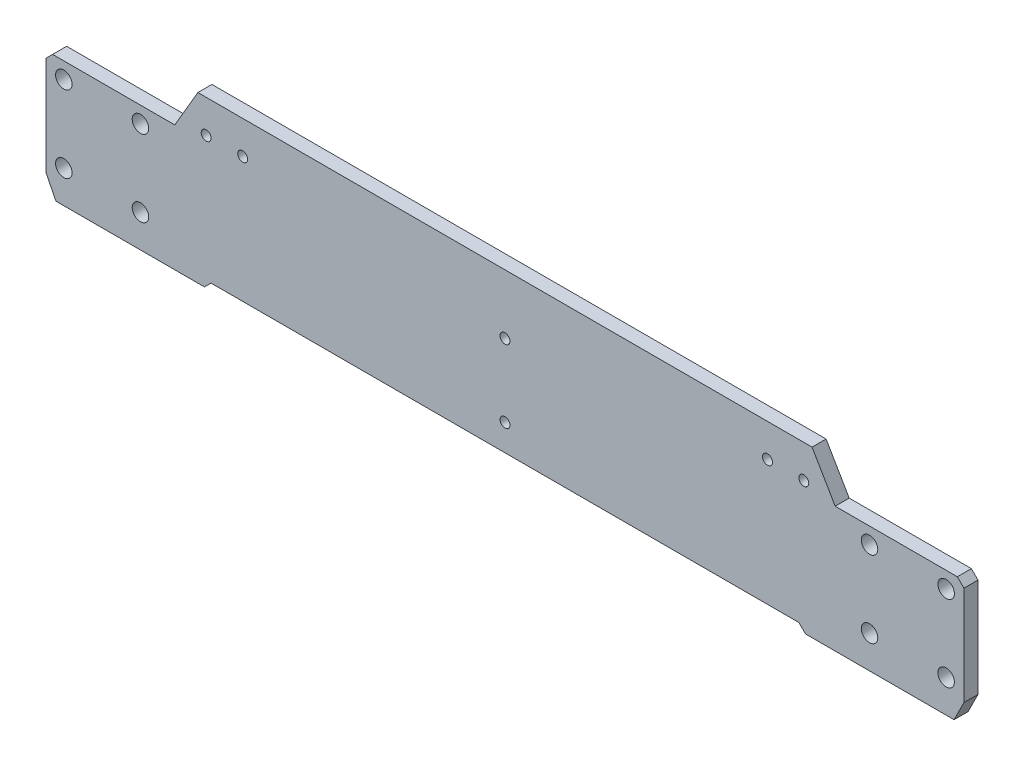
ISO-10303-21;
HEADER;
FILE_DESCRIPTION(('STEP AP214'),'2;1');
FILE_NAME('part.step','',(''),(''),'','','');
FILE_SCHEMA(('AUTOMOTIVE_DESIGN { 1 0 10303 214 1 1 1 1 }'));
ENDSEC;
DATA;
#1=APPLICATION_CONTEXT('core data for automotive mechanical design processes');
#2=APPLICATION_PROTOCOL_DEFINITION('international standard','automotive_design',2000,#1);
#3=PRODUCT_CONTEXT('',#1,'mechanical');
#4=PRODUCT('Part','Part','',(#3));
#5=PRODUCT_RELATED_PRODUCT_CATEGORY('part','',(#4));
#6=PRODUCT_DEFINITION_FORMATION('','',#4);
#7=PRODUCT_DEFINITION_CONTEXT('part definition',#1,'design');
#8=PRODUCT_DEFINITION('design','',#6,#7);
#9=PRODUCT_DEFINITION_SHAPE('','',#8);
#10=(LENGTH_UNIT() NAMED_UNIT(*) SI_UNIT(.MILLI.,.METRE.));
#11=(NAMED_UNIT(*) PLANE_ANGLE_UNIT() SI_UNIT($,.RADIAN.));
#12=(NAMED_UNIT(*) SI_UNIT($,.STERADIAN.) SOLID_ANGLE_UNIT());
#13=UNCERTAINTY_MEASURE_WITH_UNIT(LENGTH_MEASURE(1.E-05),#10,'distance_accuracy_value','');
#14=(GEOMETRIC_REPRESENTATION_CONTEXT(3) GLOBAL_UNCERTAINTY_ASSIGNED_CONTEXT((#13)) GLOBAL_UNIT_ASSIGNED_CONTEXT((#10,
#11,#12)) REPRESENTATION_CONTEXT('',''));
#15=CARTESIAN_POINT('',(0.,0.,0.));
#16=DIRECTION('',(0.,0.,1.));
#17=DIRECTION('',(1.,0.,0.));
#18=AXIS2_PLACEMENT_3D('',#15,#16,#17);
#19=CARTESIAN_POINT('',(0.,0.,4.25));
#20=DIRECTION('',(0.,0.,-1.));
#21=DIRECTION('',(-1.,0.,0.));
#22=AXIS2_PLACEMENT_3D('',#19,#20,#21);
#23=PLANE('',#22);
#24=DIRECTION('',(0.707106781186548,0.707106781186547,0.));
#25=VECTOR('',#24,1.);
#26=CARTESIAN_POINT('',(-91.,-3.,4.25));
#27=LINE('',#26,#25);
#28=CARTESIAN_POINT('',(-91.,-3.,4.25));
#29=VERTEX_POINT('',#28);
#30=CARTESIAN_POINT('',(-89.,-1.,4.25));
#31=VERTEX_POINT('',#30);
#32=EDGE_CURVE('E209',#29,#31,#27,.T.);
#33=ORIENTED_EDGE('',*,*,#32,.T.);
#34=DIRECTION('',(1.,0.,0.));
#35=VECTOR('',#34,1.);
#36=CARTESIAN_POINT('',(-89.,-1.,4.25));
#37=LINE('',#36,#35);
#38=CARTESIAN_POINT('',(89.,-1.,4.25));
#39=VERTEX_POINT('',#38);
#40=EDGE_CURVE('E117',#31,#39,#37,.T.);
#41=ORIENTED_EDGE('',*,*,#40,.T.);
#42=DIRECTION('',(0.707106781186548,-0.707106781186547,0.));
#43=VECTOR('',#42,1.);
#44=CARTESIAN_POINT('',(89.,-1.,4.25));
#45=LINE('',#44,#43);
#46=CARTESIAN_POINT('',(91.,-3.,4.25));
#47=VERTEX_POINT('',#46);
#48=EDGE_CURVE('E248',#39,#47,#45,.T.);
#49=ORIENTED_EDGE('',*,*,#48,.T.);
#50=DIRECTION('',(1.,0.,0.));
#51=VECTOR('',#50,1.);
#52=CARTESIAN_POINT('',(91.,-3.,4.25));
#53=LINE('',#52,#51);
#54=CARTESIAN_POINT('',(136.,-3.,4.25));
#55=VERTEX_POINT('',#54);
#56=EDGE_CURVE('E267',#47,#55,#53,.T.);
#57=ORIENTED_EDGE('',*,*,#56,.T.);
#58=DIRECTION('',(0.447213595499958,0.894427190999916,0.));
#59=VECTOR('',#58,1.);
#60=CARTESIAN_POINT('',(136.,-3.,4.25));
#61=LINE('',#60,#59);
#62=CARTESIAN_POINT('',(139.,3.,4.25));
#63=VERTEX_POINT('',#62);
#64=EDGE_CURVE('E264',#55,#63,#61,.T.);
#65=ORIENTED_EDGE('',*,*,#64,.T.);
#66=DIRECTION('',(0.,1.,0.));
#67=VECTOR('',#66,1.);
#68=CARTESIAN_POINT('',(139.,3.,4.25));
#69=LINE('',#68,#67);
#70=CARTESIAN_POINT('',(139.,33.,4.25));
#71=VERTEX_POINT('',#70);
#72=EDGE_CURVE('E266',#63,#71,#69,.T.);
#73=ORIENTED_EDGE('',*,*,#72,.T.);
#74=DIRECTION('',(-0.707106781186547,0.707106781186547,0.));
#75=VECTOR('',#74,1.);
#76=CARTESIAN_POINT('',(139.,33.,4.25));
#77=LINE('',#76,#75);
#78=CARTESIAN_POINT('',(137.,35.,4.25));
#79=VERTEX_POINT('',#78);
#80=EDGE_CURVE('E269',#71,#79,#77,.T.);
#81=ORIENTED_EDGE('',*,*,#80,.T.);
#82=DIRECTION('',(-1.,0.,0.));
#83=VECTOR('',#82,1.);
#84=CARTESIAN_POINT('',(137.,35.,4.25));
#85=LINE('',#84,#83);
#86=CARTESIAN_POINT('',(100.,35.,4.25));
#87=VERTEX_POINT('',#86);
#88=EDGE_CURVE('E275',#79,#87,#85,.T.);
#89=ORIENTED_EDGE('',*,*,#88,.T.);
#90=DIRECTION('',(-0.503871025524087,0.863778900898433,0.));
#91=VECTOR('',#90,1.);
#92=CARTESIAN_POINT('',(100.,35.,4.25));
#93=LINE('',#92,#91);
#94=CARTESIAN_POINT('',(93.,47.,4.25));
#95=VERTEX_POINT('',#94);
#96=EDGE_CURVE('E277',#87,#95,#93,.T.);
#97=ORIENTED_EDGE('',*,*,#96,.T.);
#98=DIRECTION('',(-1.,0.,0.));
#99=VECTOR('',#98,1.);
#100=CARTESIAN_POINT('',(93.,47.,4.25));
#101=LINE('',#100,#99);
#102=CARTESIAN_POINT('',(-93.,47.,4.25));
#103=VERTEX_POINT('',#102);
#104=EDGE_CURVE('E279',#95,#103,#101,.T.);
#105=ORIENTED_EDGE('',*,*,#104,.T.);
#106=DIRECTION('',(-0.503871025524087,-0.863778900898433,0.));
#107=VECTOR('',#106,1.);
#108=CARTESIAN_POINT('',(-93.,47.,4.25));
#109=LINE('',#108,#107);
#110=CARTESIAN_POINT('',(-100.,35.,4.25));
#111=VERTEX_POINT('',#110);
#112=EDGE_CURVE('E281',#103,#111,#109,.T.);
#113=ORIENTED_EDGE('',*,*,#112,.T.);
#114=DIRECTION('',(-1.,0.,0.));
#115=VECTOR('',#114,1.);
#116=CARTESIAN_POINT('',(-100.,35.,4.25));
#117=LINE('',#116,#115);
#118=CARTESIAN_POINT('',(-137.,35.,4.25));
#119=VERTEX_POINT('',#118);
#120=EDGE_CURVE('E283',#111,#119,#117,.T.);
#121=ORIENTED_EDGE('',*,*,#120,.T.);
#122=DIRECTION('',(-0.707106781186547,-0.707106781186547,0.));
#123=VECTOR('',#122,1.);
#124=CARTESIAN_POINT('',(-137.,35.,4.25));
#125=LINE('',#124,#123);
#126=CARTESIAN_POINT('',(-139.,33.,4.25));
#127=VERTEX_POINT('',#126);
#128=EDGE_CURVE('E160',#119,#127,#125,.T.);
#129=ORIENTED_EDGE('',*,*,#128,.T.);
#130=DIRECTION('',(0.,-1.,0.));
#131=VECTOR('',#130,1.);
#132=CARTESIAN_POINT('',(-139.,33.,4.25));
#133=LINE('',#132,#131);
#134=CARTESIAN_POINT('',(-139.,3.,4.25));
#135=VERTEX_POINT('',#134);
#136=EDGE_CURVE('E154',#127,#135,#133,.T.);
#137=ORIENTED_EDGE('',*,*,#136,.T.);
#138=DIRECTION('',(0.447213595499958,-0.894427190999916,0.));
#139=VECTOR('',#138,1.);
#140=CARTESIAN_POINT('',(-139.,3.,4.25));
#141=LINE('',#140,#139);
#142=CARTESIAN_POINT('',(-136.,-3.,4.25));
#143=VERTEX_POINT('',#142);
#144=EDGE_CURVE('E158',#135,#143,#141,.T.);
#145=ORIENTED_EDGE('',*,*,#144,.T.);
#146=DIRECTION('',(1.,0.,0.));
#147=VECTOR('',#146,1.);
#148=CARTESIAN_POINT('',(-136.,-3.,4.25));
#149=LINE('',#148,#147);
#150=EDGE_CURVE('E50',#143,#29,#149,.T.);
#151=ORIENTED_EDGE('',*,*,#150,.T.);
#152=EDGE_LOOP('',(#33,#41,#49,#57,#65,#73,#81,#89,#97,#105,#113,#121,#129,#137,#145,#151));
#153=FACE_BOUND('',#152,.T.);
#154=CARTESIAN_POINT('',(-133.600349176618,30.0998056751935,4.25));
#155=DIRECTION('',(0.,0.,1.));
#156=DIRECTION('',(1.,0.,0.));
#157=AXIS2_PLACEMENT_3D('',#154,#155,#156);
#158=CIRCLE('',#157,2.50002533855522);
#159=CARTESIAN_POINT('',(-131.100323838063,30.0998056751935,4.25));
#160=VERTEX_POINT('',#159);
#161=EDGE_CURVE('E182',#160,#160,#158,.T.);
#162=ORIENTED_EDGE('',*,*,#161,.F.);
#163=EDGE_LOOP('',(#162));
#164=FACE_BOUND('',#163,.T.);
#165=CARTESIAN_POINT('',(-110.397163400501,30.0865621547168,4.25));
#166=DIRECTION('',(0.,0.,1.));
#167=DIRECTION('',(1.,0.,0.));
#168=AXIS2_PLACEMENT_3D('',#165,#166,#167);
#169=CIRCLE('',#168,2.50003027489645);
#170=CARTESIAN_POINT('',(-107.897133125605,30.0865621547168,4.25));
#171=VERTEX_POINT('',#170);
#172=EDGE_CURVE('E447',#171,#171,#169,.T.);
#173=ORIENTED_EDGE('',*,*,#172,.F.);
#174=EDGE_LOOP('',(#173));
#175=FACE_BOUND('',#174,.T.);
#176=CARTESIAN_POINT('',(-133.597969419464,6.88582491159594,4.25));
#177=DIRECTION('',(0.,0.,1.));
#178=DIRECTION('',(1.,0.,0.));
#179=AXIS2_PLACEMENT_3D('',#176,#177,#178);
#180=CIRCLE('',#179,2.5005938502387);
#181=CARTESIAN_POINT('',(-131.097375569225,6.88582491159594,4.25));
#182=VERTEX_POINT('',#181);
#183=EDGE_CURVE('E441',#182,#182,#180,.T.);
#184=ORIENTED_EDGE('',*,*,#183,.F.);
#185=EDGE_LOOP('',(#184));
#186=FACE_BOUND('',#185,.T.);
#187=CARTESIAN_POINT('',(-110.4,6.899985,4.25));
#188=DIRECTION('',(0.,0.,1.));
#189=DIRECTION('',(1.,0.,0.));
#190=AXIS2_PLACEMENT_3D('',#187,#188,#189);
#191=CIRCLE('',#190,2.49996671038335);
#192=CARTESIAN_POINT('',(-107.900033289617,6.899985,4.25));
#193=VERTEX_POINT('',#192);
#194=EDGE_CURVE('E435',#193,#193,#191,.T.);
#195=ORIENTED_EDGE('',*,*,#194,.F.);
#196=EDGE_LOOP('',(#195));
#197=FACE_BOUND('',#196,.T.);
#198=CARTESIAN_POINT('',(-90.5,37.,4.25));
#199=DIRECTION('',(0.,0.,1.));
#200=DIRECTION('',(1.,0.,0.));
#201=AXIS2_PLACEMENT_3D('',#198,#199,#200);
#202=CIRCLE('',#201,1.50000660331879);
#203=CARTESIAN_POINT('',(-88.9999933966812,37.,4.25));
#204=VERTEX_POINT('',#203);
#205=EDGE_CURVE('E429',#204,#204,#202,.T.);
#206=ORIENTED_EDGE('',*,*,#205,.F.);
#207=EDGE_LOOP('',(#206));
#208=FACE_BOUND('',#207,.T.);
#209=CARTESIAN_POINT('',(-79.4350473912035,37.0054032383916,4.25));
#210=DIRECTION('',(0.,0.,1.));
#211=DIRECTION('',(1.,0.,0.));
#212=AXIS2_PLACEMENT_3D('',#209,#210,#211);
#213=CIRCLE('',#212,1.50001782666786);
#214=CARTESIAN_POINT('',(-77.9350295645357,37.0054032383916,4.25));
#215=VERTEX_POINT('',#214);
#216=EDGE_CURVE('E423',#215,#215,#213,.T.);
#217=ORIENTED_EDGE('',*,*,#216,.F.);
#218=EDGE_LOOP('',(#217));
#219=FACE_BOUND('',#218,.T.);
#220=CARTESIAN_POINT('',(1.62173108149942E-05,29.0000211501111,4.25));
#221=DIRECTION('',(0.,0.,1.));
#222=DIRECTION('',(1.,0.,0.));
#223=AXIS2_PLACEMENT_3D('',#220,#221,#222);
#224=CIRCLE('',#223,1.49999342487398);
#225=CARTESIAN_POINT('',(1.50000964218479,29.0000211501111,4.25));
#226=VERTEX_POINT('',#225);
#227=EDGE_CURVE('E417',#226,#226,#224,.T.);
#228=ORIENTED_EDGE('',*,*,#227,.F.);
#229=EDGE_LOOP('',(#228));
#230=FACE_BOUND('',#229,.T.);
#231=CARTESIAN_POINT('',(0.00751282601199458,6.99318405140734,4.25));
#232=DIRECTION('',(0.,0.,1.));
#233=DIRECTION('',(1.,0.,0.));
#234=AXIS2_PLACEMENT_3D('',#231,#232,#233);
#235=CIRCLE('',#234,1.50000156687934);
#236=CARTESIAN_POINT('',(1.50751439289133,6.99318405140734,4.25));
#237=VERTEX_POINT('',#236);
#238=EDGE_CURVE('E411',#237,#237,#235,.T.);
#239=ORIENTED_EDGE('',*,*,#238,.F.);
#240=EDGE_LOOP('',(#239));
#241=FACE_BOUND('',#240,.T.);
#242=CARTESIAN_POINT('',(79.5,37.,4.25));
#243=DIRECTION('',(0.,0.,1.));
#244=DIRECTION('',(1.,0.,0.));
#245=AXIS2_PLACEMENT_3D('',#242,#243,#244);
#246=CIRCLE('',#245,1.50000660331879);
#247=CARTESIAN_POINT('',(81.0000066033188,37.,4.25));
#248=VERTEX_POINT('',#247);
#249=EDGE_CURVE('E405',#248,#248,#246,.T.);
#250=ORIENTED_EDGE('',*,*,#249,.F.);
#251=EDGE_LOOP('',(#250));
#252=FACE_BOUND('',#251,.T.);
#253=CARTESIAN_POINT('',(90.5000059832746,37.0000112902454,4.25));
#254=DIRECTION('',(0.,0.,1.));
#255=DIRECTION('',(1.,0.,0.));
#256=AXIS2_PLACEMENT_3D('',#253,#254,#255);
#257=CIRCLE('',#256,1.49999401676786);
#258=CARTESIAN_POINT('',(92.0000000000425,37.0000112902454,4.25));
#259=VERTEX_POINT('',#258);
#260=EDGE_CURVE('E399',#259,#259,#257,.T.);
#261=ORIENTED_EDGE('',*,*,#260,.F.);
#262=EDGE_LOOP('',(#261));
#263=FACE_BOUND('',#262,.T.);
#264=CARTESIAN_POINT('',(110.399953709018,30.1000436867498,4.25));
#265=DIRECTION('',(0.,0.,1.));
#266=DIRECTION('',(1.,0.,0.));
#267=AXIS2_PLACEMENT_3D('',#264,#265,#266);
#268=CIRCLE('',#267,2.50004629136359);
#269=CARTESIAN_POINT('',(112.900000000382,30.1000436867498,4.25));
#270=VERTEX_POINT('',#269);
#271=EDGE_CURVE('E393',#270,#270,#268,.T.);
#272=ORIENTED_EDGE('',*,*,#271,.F.);
#273=EDGE_LOOP('',(#272));
#274=FACE_BOUND('',#273,.T.);
#275=CARTESIAN_POINT('',(133.599796532046,30.0999596192979,4.25));
#276=DIRECTION('',(0.,0.,1.));
#277=DIRECTION('',(1.,0.,0.));
#278=AXIS2_PLACEMENT_3D('',#275,#276,#277);
#279=CIRCLE('',#278,2.50020346828058);
#280=CARTESIAN_POINT('',(136.100000000326,30.0999596192979,4.25));
#281=VERTEX_POINT('',#280);
#282=EDGE_CURVE('E387',#281,#281,#279,.T.);
#283=ORIENTED_EDGE('',*,*,#282,.F.);
#284=EDGE_LOOP('',(#283));
#285=FACE_BOUND('',#284,.T.);
#286=CARTESIAN_POINT('',(110.399965537475,6.89991325703595,4.25));
#287=DIRECTION('',(0.,0.,1.));
#288=DIRECTION('',(1.,0.,0.));
#289=AXIS2_PLACEMENT_3D('',#286,#287,#288);
#290=CIRCLE('',#289,2.50003446370288);
#291=CARTESIAN_POINT('',(112.900000001178,6.89991325703595,4.25));
#292=VERTEX_POINT('',#291);
#293=EDGE_CURVE('E381',#292,#292,#290,.T.);
#294=ORIENTED_EDGE('',*,*,#293,.F.);
#295=EDGE_LOOP('',(#294));
#296=FACE_BOUND('',#295,.T.);
#297=CARTESIAN_POINT('',(133.599879489075,6.89978671149171,4.25));
#298=DIRECTION('',(0.,0.,1.));
#299=DIRECTION('',(1.,0.,0.));
#300=AXIS2_PLACEMENT_3D('',#297,#298,#299);
#301=CIRCLE('',#300,2.50015133773584);
#302=CARTESIAN_POINT('',(136.100030826811,6.89978671149171,4.25));
#303=VERTEX_POINT('',#302);
#304=EDGE_CURVE('E372',#303,#303,#301,.T.);
#305=ORIENTED_EDGE('',*,*,#304,.F.);
#306=EDGE_LOOP('',(#305));
#307=FACE_BOUND('',#306,.T.);
#308=ADVANCED_FACE('F33',(#153,#164,#175,#186,#197,#208,#219,#230,#241,#252,#263,#274,#285,#296,
#307),#23,.F.);
#309=CARTESIAN_POINT('',(0.,0.,0.));
#310=DIRECTION('',(0.,0.,-1.));
#311=DIRECTION('',(-1.,0.,0.));
#312=AXIS2_PLACEMENT_3D('',#309,#310,#311);
#313=PLANE('',#312);
#314=CARTESIAN_POINT('',(110.399965537475,6.89991325703595,0.));
#315=DIRECTION('',(0.,0.,1.));
#316=DIRECTION('',(1.,0.,0.));
#317=AXIS2_PLACEMENT_3D('',#314,#315,#316);
#318=CIRCLE('',#317,2.50003446370288);
#319=CARTESIAN_POINT('',(112.900000001178,6.89991325703595,0.));
#320=VERTEX_POINT('',#319);
#321=EDGE_CURVE('E378',#320,#320,#318,.T.);
#322=ORIENTED_EDGE('',*,*,#321,.T.);
#323=EDGE_LOOP('',(#322));
#324=FACE_BOUND('',#323,.T.);
#325=CARTESIAN_POINT('',(110.399953709018,30.1000436867498,0.));
#326=DIRECTION('',(0.,0.,1.));
#327=DIRECTION('',(1.,0.,0.));
#328=AXIS2_PLACEMENT_3D('',#325,#326,#327);
#329=CIRCLE('',#328,2.50004629136359);
#330=CARTESIAN_POINT('',(112.900000000382,30.1000436867498,0.));
#331=VERTEX_POINT('',#330);
#332=EDGE_CURVE('E390',#331,#331,#329,.T.);
#333=ORIENTED_EDGE('',*,*,#332,.T.);
#334=EDGE_LOOP('',(#333));
#335=FACE_BOUND('',#334,.T.);
#336=CARTESIAN_POINT('',(79.5,37.,0.));
#337=DIRECTION('',(0.,0.,1.));
#338=DIRECTION('',(1.,0.,0.));
#339=AXIS2_PLACEMENT_3D('',#336,#337,#338);
#340=CIRCLE('',#339,1.50000660331879);
#341=CARTESIAN_POINT('',(81.0000066033188,37.,0.));
#342=VERTEX_POINT('',#341);
#343=EDGE_CURVE('E402',#342,#342,#340,.T.);
#344=ORIENTED_EDGE('',*,*,#343,.T.);
#345=EDGE_LOOP('',(#344));
#346=FACE_BOUND('',#345,.T.);
#347=CARTESIAN_POINT('',(1.62173108149942E-05,29.0000211501111,0.));
#348=DIRECTION('',(0.,0.,1.));
#349=DIRECTION('',(1.,0.,0.));
#350=AXIS2_PLACEMENT_3D('',#347,#348,#349);
#351=CIRCLE('',#350,1.49999342487398);
#352=CARTESIAN_POINT('',(1.50000964218479,29.0000211501111,0.));
#353=VERTEX_POINT('',#352);
#354=EDGE_CURVE('E414',#353,#353,#351,.T.);
#355=ORIENTED_EDGE('',*,*,#354,.T.);
#356=EDGE_LOOP('',(#355));
#357=FACE_BOUND('',#356,.T.);
#358=CARTESIAN_POINT('',(-90.5,37.,0.));
#359=DIRECTION('',(0.,0.,1.));
#360=DIRECTION('',(1.,0.,0.));
#361=AXIS2_PLACEMENT_3D('',#358,#359,#360);
#362=CIRCLE('',#361,1.50000660331879);
#363=CARTESIAN_POINT('',(-88.9999933966812,37.,0.));
#364=VERTEX_POINT('',#363);
#365=EDGE_CURVE('E426',#364,#364,#362,.T.);
#366=ORIENTED_EDGE('',*,*,#365,.T.);
#367=EDGE_LOOP('',(#366));
#368=FACE_BOUND('',#367,.T.);
#369=CARTESIAN_POINT('',(-133.597969419464,6.88582491159594,0.));
#370=DIRECTION('',(0.,0.,1.));
#371=DIRECTION('',(1.,0.,0.));
#372=AXIS2_PLACEMENT_3D('',#369,#370,#371);
#373=CIRCLE('',#372,2.5005938502387);
#374=CARTESIAN_POINT('',(-131.097375569225,6.88582491159594,0.));
#375=VERTEX_POINT('',#374);
#376=EDGE_CURVE('E438',#375,#375,#373,.T.);
#377=ORIENTED_EDGE('',*,*,#376,.T.);
#378=EDGE_LOOP('',(#377));
#379=FACE_BOUND('',#378,.T.);
#380=CARTESIAN_POINT('',(-133.600349176618,30.0998056751935,0.));
#381=DIRECTION('',(0.,0.,1.));
#382=DIRECTION('',(1.,0.,0.));
#383=AXIS2_PLACEMENT_3D('',#380,#381,#382);
#384=CIRCLE('',#383,2.50002533855522);
#385=CARTESIAN_POINT('',(-131.100323838063,30.0998056751935,0.));
#386=VERTEX_POINT('',#385);
#387=EDGE_CURVE('E450',#386,#386,#384,.T.);
#388=ORIENTED_EDGE('',*,*,#387,.T.);
#389=EDGE_LOOP('',(#388));
#390=FACE_BOUND('',#389,.T.);
#391=DIRECTION('',(0.707106781186548,0.707106781186547,0.));
#392=VECTOR('',#391,1.);
#393=CARTESIAN_POINT('',(-91.,-3.,0.));
#394=LINE('',#393,#392);
#395=CARTESIAN_POINT('',(-91.,-3.,0.));
#396=VERTEX_POINT('',#395);
#397=CARTESIAN_POINT('',(-89.,-1.,0.));
#398=VERTEX_POINT('',#397);
#399=EDGE_CURVE('E178',#396,#398,#394,.T.);
#400=ORIENTED_EDGE('',*,*,#399,.F.);
#401=DIRECTION('',(1.,0.,0.));
#402=VECTOR('',#401,1.);
#403=CARTESIAN_POINT('',(-136.,-3.,0.));
#404=LINE('',#403,#402);
#405=CARTESIAN_POINT('',(-136.,-3.,0.));
#406=VERTEX_POINT('',#405);
#407=EDGE_CURVE('E109',#406,#396,#404,.T.);
#408=ORIENTED_EDGE('',*,*,#407,.F.);
#409=DIRECTION('',(0.447213595499958,-0.894427190999916,0.));
#410=VECTOR('',#409,1.);
#411=CARTESIAN_POINT('',(-139.,3.,0.));
#412=LINE('',#411,#410);
#413=CARTESIAN_POINT('',(-139.,3.,0.));
#414=VERTEX_POINT('',#413);
#415=EDGE_CURVE('E103',#414,#406,#412,.T.);
#416=ORIENTED_EDGE('',*,*,#415,.F.);
#417=DIRECTION('',(0.,-1.,0.));
#418=VECTOR('',#417,1.);
#419=CARTESIAN_POINT('',(-139.,33.,0.));
#420=LINE('',#419,#418);
#421=CARTESIAN_POINT('',(-139.,33.,0.));
#422=VERTEX_POINT('',#421);
#423=EDGE_CURVE('E168',#422,#414,#420,.T.);
#424=ORIENTED_EDGE('',*,*,#423,.F.);
#425=DIRECTION('',(-0.707106781186547,-0.707106781186547,0.));
#426=VECTOR('',#425,1.);
#427=CARTESIAN_POINT('',(-137.,35.,0.));
#428=LINE('',#427,#426);
#429=CARTESIAN_POINT('',(-137.,35.,0.));
#430=VERTEX_POINT('',#429);
#431=EDGE_CURVE('E204',#430,#422,#428,.T.);
#432=ORIENTED_EDGE('',*,*,#431,.F.);
#433=DIRECTION('',(-1.,0.,0.));
#434=VECTOR('',#433,1.);
#435=CARTESIAN_POINT('',(-100.,35.,0.));
#436=LINE('',#435,#434);
#437=CARTESIAN_POINT('',(-100.,35.,0.));
#438=VERTEX_POINT('',#437);
#439=EDGE_CURVE('E202',#438,#430,#436,.T.);
#440=ORIENTED_EDGE('',*,*,#439,.F.);
#441=DIRECTION('',(-0.503871025524087,-0.863778900898433,0.));
#442=VECTOR('',#441,1.);
#443=CARTESIAN_POINT('',(-93.,47.,0.));
#444=LINE('',#443,#442);
#445=CARTESIAN_POINT('',(-93.,47.,0.));
#446=VERTEX_POINT('',#445);
#447=EDGE_CURVE('E200',#446,#438,#444,.T.);
#448=ORIENTED_EDGE('',*,*,#447,.F.);
#449=DIRECTION('',(-1.,0.,0.));
#450=VECTOR('',#449,1.);
#451=CARTESIAN_POINT('',(93.,47.,0.));
#452=LINE('',#451,#450);
#453=CARTESIAN_POINT('',(93.,47.,0.));
#454=VERTEX_POINT('',#453);
#455=EDGE_CURVE('E198',#454,#446,#452,.T.);
#456=ORIENTED_EDGE('',*,*,#455,.F.);
#457=DIRECTION('',(-0.503871025524087,0.863778900898433,0.));
#458=VECTOR('',#457,1.);
#459=CARTESIAN_POINT('',(100.,35.,0.));
#460=LINE('',#459,#458);
#461=CARTESIAN_POINT('',(100.,35.,0.));
#462=VERTEX_POINT('',#461);
#463=EDGE_CURVE('E196',#462,#454,#460,.T.);
#464=ORIENTED_EDGE('',*,*,#463,.F.);
#465=DIRECTION('',(-1.,0.,0.));
#466=VECTOR('',#465,1.);
#467=CARTESIAN_POINT('',(137.,35.,0.));
#468=LINE('',#467,#466);
#469=CARTESIAN_POINT('',(137.,35.,0.));
#470=VERTEX_POINT('',#469);
#471=EDGE_CURVE('E194',#470,#462,#468,.T.);
#472=ORIENTED_EDGE('',*,*,#471,.F.);
#473=DIRECTION('',(-0.707106781186547,0.707106781186547,0.));
#474=VECTOR('',#473,1.);
#475=CARTESIAN_POINT('',(139.,33.,0.));
#476=LINE('',#475,#474);
#477=CARTESIAN_POINT('',(139.,33.,0.));
#478=VERTEX_POINT('',#477);
#479=EDGE_CURVE('E192',#478,#470,#476,.T.);
#480=ORIENTED_EDGE('',*,*,#479,.F.);
#481=DIRECTION('',(0.,1.,0.));
#482=VECTOR('',#481,1.);
#483=CARTESIAN_POINT('',(139.,3.,0.));
#484=LINE('',#483,#482);
#485=CARTESIAN_POINT('',(139.,3.,0.));
#486=VERTEX_POINT('',#485);
#487=EDGE_CURVE('E190',#486,#478,#484,.T.);
#488=ORIENTED_EDGE('',*,*,#487,.F.);
#489=DIRECTION('',(0.447213595499958,0.894427190999916,0.));
#490=VECTOR('',#489,1.);
#491=CARTESIAN_POINT('',(136.,-3.,0.));
#492=LINE('',#491,#490);
#493=CARTESIAN_POINT('',(136.,-3.,0.));
#494=VERTEX_POINT('',#493);
#495=EDGE_CURVE('E188',#494,#486,#492,.T.);
#496=ORIENTED_EDGE('',*,*,#495,.F.);
#497=DIRECTION('',(1.,0.,0.));
#498=VECTOR('',#497,1.);
#499=CARTESIAN_POINT('',(91.,-3.,0.));
#500=LINE('',#499,#498);
#501=CARTESIAN_POINT('',(91.,-3.,0.));
#502=VERTEX_POINT('',#501);
#503=EDGE_CURVE('E186',#502,#494,#500,.T.);
#504=ORIENTED_EDGE('',*,*,#503,.F.);
#505=DIRECTION('',(0.707106781186548,-0.707106781186547,0.));
#506=VECTOR('',#505,1.);
#507=CARTESIAN_POINT('',(89.,-1.,0.));
#508=LINE('',#507,#506);
#509=CARTESIAN_POINT('',(89.,-1.,0.));
#510=VERTEX_POINT('',#509);
#511=EDGE_CURVE('E184',#510,#502,#508,.T.);
#512=ORIENTED_EDGE('',*,*,#511,.F.);
#513=DIRECTION('',(1.,0.,0.));
#514=VECTOR('',#513,1.);
#515=CARTESIAN_POINT('',(-89.,-1.,0.));
#516=LINE('',#515,#514);
#517=EDGE_CURVE('E181',#398,#510,#516,.T.);
#518=ORIENTED_EDGE('',*,*,#517,.F.);
#519=EDGE_LOOP('',(#400,#408,#416,#424,#432,#440,#448,#456,#464,#472,#480,#488,#496,#504,#512,#518));
#520=FACE_BOUND('',#519,.T.);
#521=CARTESIAN_POINT('',(-110.397163400501,30.0865621547168,0.));
#522=DIRECTION('',(0.,0.,1.));
#523=DIRECTION('',(1.,0.,0.));
#524=AXIS2_PLACEMENT_3D('',#521,#522,#523);
#525=CIRCLE('',#524,2.50003027489645);
#526=CARTESIAN_POINT('',(-107.897133125605,30.0865621547168,0.));
#527=VERTEX_POINT('',#526);
#528=EDGE_CURVE('E444',#527,#527,#525,.T.);
#529=ORIENTED_EDGE('',*,*,#528,.T.);
#530=EDGE_LOOP('',(#529));
#531=FACE_BOUND('',#530,.T.);
#532=CARTESIAN_POINT('',(-110.4,6.899985,0.));
#533=DIRECTION('',(0.,0.,1.));
#534=DIRECTION('',(1.,0.,0.));
#535=AXIS2_PLACEMENT_3D('',#532,#533,#534);
#536=CIRCLE('',#535,2.49996671038335);
#537=CARTESIAN_POINT('',(-107.900033289617,6.899985,0.));
#538=VERTEX_POINT('',#537);
#539=EDGE_CURVE('E432',#538,#538,#536,.T.);
#540=ORIENTED_EDGE('',*,*,#539,.T.);
#541=EDGE_LOOP('',(#540));
#542=FACE_BOUND('',#541,.T.);
#543=CARTESIAN_POINT('',(-79.4350473912035,37.0054032383916,0.));
#544=DIRECTION('',(0.,0.,1.));
#545=DIRECTION('',(1.,0.,0.));
#546=AXIS2_PLACEMENT_3D('',#543,#544,#545);
#547=CIRCLE('',#546,1.50001782666786);
#548=CARTESIAN_POINT('',(-77.9350295645357,37.0054032383916,0.));
#549=VERTEX_POINT('',#548);
#550=EDGE_CURVE('E420',#549,#549,#547,.T.);
#551=ORIENTED_EDGE('',*,*,#550,.T.);
#552=EDGE_LOOP('',(#551));
#553=FACE_BOUND('',#552,.T.);
#554=CARTESIAN_POINT('',(0.00751282601199458,6.99318405140734,0.));
#555=DIRECTION('',(0.,0.,1.));
#556=DIRECTION('',(1.,0.,0.));
#557=AXIS2_PLACEMENT_3D('',#554,#555,#556);
#558=CIRCLE('',#557,1.50000156687934);
#559=CARTESIAN_POINT('',(1.50751439289133,6.99318405140734,0.));
#560=VERTEX_POINT('',#559);
#561=EDGE_CURVE('E408',#560,#560,#558,.T.);
#562=ORIENTED_EDGE('',*,*,#561,.T.);
#563=EDGE_LOOP('',(#562));
#564=FACE_BOUND('',#563,.T.);
#565=CARTESIAN_POINT('',(90.5000059832746,37.0000112902454,0.));
#566=DIRECTION('',(0.,0.,1.));
#567=DIRECTION('',(1.,0.,0.));
#568=AXIS2_PLACEMENT_3D('',#565,#566,#567);
#569=CIRCLE('',#568,1.49999401676786);
#570=CARTESIAN_POINT('',(92.0000000000425,37.0000112902454,0.));
#571=VERTEX_POINT('',#570);
#572=EDGE_CURVE('E396',#571,#571,#569,.T.);
#573=ORIENTED_EDGE('',*,*,#572,.T.);
#574=EDGE_LOOP('',(#573));
#575=FACE_BOUND('',#574,.T.);
#576=CARTESIAN_POINT('',(133.599796532046,30.0999596192979,0.));
#577=DIRECTION('',(0.,0.,1.));
#578=DIRECTION('',(1.,0.,0.));
#579=AXIS2_PLACEMENT_3D('',#576,#577,#578);
#580=CIRCLE('',#579,2.50020346828058);
#581=CARTESIAN_POINT('',(136.100000000326,30.0999596192979,0.));
#582=VERTEX_POINT('',#581);
#583=EDGE_CURVE('E384',#582,#582,#580,.T.);
#584=ORIENTED_EDGE('',*,*,#583,.T.);
#585=EDGE_LOOP('',(#584));
#586=FACE_BOUND('',#585,.T.);
#587=CARTESIAN_POINT('',(133.599879489075,6.89978671149171,0.));
#588=DIRECTION('',(0.,0.,1.));
#589=DIRECTION('',(1.,0.,0.));
#590=AXIS2_PLACEMENT_3D('',#587,#588,#589);
#591=CIRCLE('',#590,2.50015133773584);
#592=CARTESIAN_POINT('',(136.100030826811,6.89978671149171,0.));
#593=VERTEX_POINT('',#592);
#594=EDGE_CURVE('E375',#593,#593,#591,.T.);
#595=ORIENTED_EDGE('',*,*,#594,.T.);
#596=EDGE_LOOP('',(#595));
#597=FACE_BOUND('',#596,.T.);
#598=ADVANCED_FACE('F252',(#324,#335,#346,#357,#368,#379,#390,#520,#531,#542,#553,#564,#575,
#586,#597),#313,.T.);
#599=CARTESIAN_POINT('',(-91.,-3.,4.25));
#600=DIRECTION('',(-0.707106781186547,0.707106781186548,0.));
#601=DIRECTION('',(-0.707106781186548,-0.707106781186547,0.));
#602=AXIS2_PLACEMENT_3D('',#599,#600,#601);
#603=PLANE('',#602);
#604=ORIENTED_EDGE('',*,*,#399,.T.);
#605=DIRECTION('',(0.,0.,-1.));
#606=VECTOR('',#605,1.);
#607=CARTESIAN_POINT('',(-89.,-1.,4.25));
#608=LINE('',#607,#606);
#609=EDGE_CURVE('E11',#31,#398,#608,.T.);
#610=ORIENTED_EDGE('',*,*,#609,.F.);
#611=ORIENTED_EDGE('',*,*,#32,.F.);
#612=DIRECTION('',(0.,0.,-1.));
#613=VECTOR('',#612,1.);
#614=CARTESIAN_POINT('',(-91.,-3.,4.25));
#615=LINE('',#614,#613);
#616=EDGE_CURVE('E174',#29,#396,#615,.T.);
#617=ORIENTED_EDGE('',*,*,#616,.T.);
#618=EDGE_LOOP('',(#604,#610,#611,#617));
#619=FACE_BOUND('',#618,.T.);
#620=ADVANCED_FACE('F35',(#619),#603,.F.);
#621=CARTESIAN_POINT('',(-89.,-1.,4.25));
#622=DIRECTION('',(0.,1.,0.));
#623=DIRECTION('',(0.,0.,1.));
#624=AXIS2_PLACEMENT_3D('',#621,#622,#623);
#625=PLANE('',#624);
#626=ORIENTED_EDGE('',*,*,#517,.T.);
#627=DIRECTION('',(0.,0.,-1.));
#628=VECTOR('',#627,1.);
#629=CARTESIAN_POINT('',(89.,-1.,4.25));
#630=LINE('',#629,#628);
#631=EDGE_CURVE('E42',#39,#510,#630,.T.);
#632=ORIENTED_EDGE('',*,*,#631,.F.);
#633=ORIENTED_EDGE('',*,*,#40,.F.);
#634=ORIENTED_EDGE('',*,*,#609,.T.);
#635=EDGE_LOOP('',(#626,#632,#633,#634));
#636=FACE_BOUND('',#635,.T.);
#637=ADVANCED_FACE('F692',(#636),#625,.F.);
#638=CARTESIAN_POINT('',(89.,-1.,4.25));
#639=DIRECTION('',(0.707106781186547,0.707106781186548,0.));
#640=DIRECTION('',(-0.707106781186548,0.707106781186547,0.));
#641=AXIS2_PLACEMENT_3D('',#638,#639,#640);
#642=PLANE('',#641);
#643=ORIENTED_EDGE('',*,*,#511,.T.);
#644=DIRECTION('',(0.,0.,-1.));
#645=VECTOR('',#644,1.);
#646=CARTESIAN_POINT('',(91.,-3.,4.25));
#647=LINE('',#646,#645);
#648=EDGE_CURVE('E240',#47,#502,#647,.T.);
#649=ORIENTED_EDGE('',*,*,#648,.F.);
#650=ORIENTED_EDGE('',*,*,#48,.F.);
#651=ORIENTED_EDGE('',*,*,#631,.T.);
#652=EDGE_LOOP('',(#643,#649,#650,#651));
#653=FACE_BOUND('',#652,.T.);
#654=ADVANCED_FACE('F246',(#653),#642,.F.);
#655=CARTESIAN_POINT('',(91.,-3.,4.25));
#656=DIRECTION('',(0.,1.,0.));
#657=DIRECTION('',(0.,0.,1.));
#658=AXIS2_PLACEMENT_3D('',#655,#656,#657);
#659=PLANE('',#658);
#660=ORIENTED_EDGE('',*,*,#503,.T.);
#661=DIRECTION('',(0.,0.,-1.));
#662=VECTOR('',#661,1.);
#663=CARTESIAN_POINT('',(136.,-3.,4.25));
#664=LINE('',#663,#662);
#665=EDGE_CURVE('E237',#55,#494,#664,.T.);
#666=ORIENTED_EDGE('',*,*,#665,.F.);
#667=ORIENTED_EDGE('',*,*,#56,.F.);
#668=ORIENTED_EDGE('',*,*,#648,.T.);
#669=EDGE_LOOP('',(#660,#666,#667,#668));
#670=FACE_BOUND('',#669,.T.);
#671=ADVANCED_FACE('F258',(#670),#659,.F.);
#672=CARTESIAN_POINT('',(136.,-3.,4.25));
#673=DIRECTION('',(-0.894427190999916,0.447213595499958,0.));
#674=DIRECTION('',(-0.447213595499958,-0.894427190999916,0.));
#675=AXIS2_PLACEMENT_3D('',#672,#673,#674);
#676=PLANE('',#675);
#677=ORIENTED_EDGE('',*,*,#495,.T.);
#678=DIRECTION('',(0.,0.,-1.));
#679=VECTOR('',#678,1.);
#680=CARTESIAN_POINT('',(139.,3.,4.25));
#681=LINE('',#680,#679);
#682=EDGE_CURVE('E234',#63,#486,#681,.T.);
#683=ORIENTED_EDGE('',*,*,#682,.F.);
#684=ORIENTED_EDGE('',*,*,#64,.F.);
#685=ORIENTED_EDGE('',*,*,#665,.T.);
#686=EDGE_LOOP('',(#677,#683,#684,#685));
#687=FACE_BOUND('',#686,.T.);
#688=ADVANCED_FACE('F262',(#687),#676,.F.);
#689=CARTESIAN_POINT('',(139.,3.,4.25));
#690=DIRECTION('',(-1.,0.,0.));
#691=DIRECTION('',(0.,0.,1.));
#692=AXIS2_PLACEMENT_3D('',#689,#690,#691);
#693=PLANE('',#692);
#694=ORIENTED_EDGE('',*,*,#487,.T.);
#695=DIRECTION('',(0.,0.,-1.));
#696=VECTOR('',#695,1.);
#697=CARTESIAN_POINT('',(139.,33.,4.25));
#698=LINE('',#697,#696);
#699=EDGE_CURVE('E231',#71,#478,#698,.T.);
#700=ORIENTED_EDGE('',*,*,#699,.F.);
#701=ORIENTED_EDGE('',*,*,#72,.F.);
#702=ORIENTED_EDGE('',*,*,#682,.T.);
#703=EDGE_LOOP('',(#694,#700,#701,#702));
#704=FACE_BOUND('',#703,.T.);
#705=ADVANCED_FACE('F657',(#704),#693,.F.);
#706=CARTESIAN_POINT('',(139.,33.,4.25));
#707=DIRECTION('',(-0.707106781186548,-0.707106781186548,0.));
#708=DIRECTION('',(0.707106781186548,-0.707106781186548,0.));
#709=AXIS2_PLACEMENT_3D('',#706,#707,#708);
#710=PLANE('',#709);
#711=ORIENTED_EDGE('',*,*,#479,.T.);
#712=DIRECTION('',(0.,0.,-1.));
#713=VECTOR('',#712,1.);
#714=CARTESIAN_POINT('',(137.,35.,4.25));
#715=LINE('',#714,#713);
#716=EDGE_CURVE('E228',#79,#470,#715,.T.);
#717=ORIENTED_EDGE('',*,*,#716,.F.);
#718=ORIENTED_EDGE('',*,*,#80,.F.);
#719=ORIENTED_EDGE('',*,*,#699,.T.);
#720=EDGE_LOOP('',(#711,#717,#718,#719));
#721=FACE_BOUND('',#720,.T.);
#722=ADVANCED_FACE('F647',(#721),#710,.F.);
#723=CARTESIAN_POINT('',(137.,35.,4.25));
#724=DIRECTION('',(0.,-1.,0.));
#725=DIRECTION('',(0.,0.,-1.));
#726=AXIS2_PLACEMENT_3D('',#723,#724,#725);
#727=PLANE('',#726);
#728=ORIENTED_EDGE('',*,*,#471,.T.);
#729=DIRECTION('',(0.,0.,-1.));
#730=VECTOR('',#729,1.);
#731=CARTESIAN_POINT('',(100.,35.,4.25));
#732=LINE('',#731,#730);
#733=EDGE_CURVE('E225',#87,#462,#732,.T.);
#734=ORIENTED_EDGE('',*,*,#733,.F.);
#735=ORIENTED_EDGE('',*,*,#88,.F.);
#736=ORIENTED_EDGE('',*,*,#716,.T.);
#737=EDGE_LOOP('',(#728,#734,#735,#736));
#738=FACE_BOUND('',#737,.T.);
#739=ADVANCED_FACE('F637',(#738),#727,.F.);
#740=CARTESIAN_POINT('',(100.,35.,4.25));
#741=DIRECTION('',(-0.863778900898433,-0.503871025524087,0.));
#742=DIRECTION('',(0.503871025524087,-0.863778900898433,0.));
#743=AXIS2_PLACEMENT_3D('',#740,#741,#742);
#744=PLANE('',#743);
#745=ORIENTED_EDGE('',*,*,#463,.T.);
#746=DIRECTION('',(0.,0.,-1.));
#747=VECTOR('',#746,1.);
#748=CARTESIAN_POINT('',(93.,47.,4.25));
#749=LINE('',#748,#747);
#750=EDGE_CURVE('E222',#95,#454,#749,.T.);
#751=ORIENTED_EDGE('',*,*,#750,.F.);
#752=ORIENTED_EDGE('',*,*,#96,.F.);
#753=ORIENTED_EDGE('',*,*,#733,.T.);
#754=EDGE_LOOP('',(#745,#751,#752,#753));
#755=FACE_BOUND('',#754,.T.);
#756=ADVANCED_FACE('F627',(#755),#744,.F.);
#757=CARTESIAN_POINT('',(93.,47.,4.25));
#758=DIRECTION('',(0.,-1.,0.));
#759=DIRECTION('',(0.,0.,-1.));
#760=AXIS2_PLACEMENT_3D('',#757,#758,#759);
#761=PLANE('',#760);
#762=ORIENTED_EDGE('',*,*,#455,.T.);
#763=DIRECTION('',(0.,0.,-1.));
#764=VECTOR('',#763,1.);
#765=CARTESIAN_POINT('',(-93.,47.,4.25));
#766=LINE('',#765,#764);
#767=EDGE_CURVE('E219',#103,#446,#766,.T.);
#768=ORIENTED_EDGE('',*,*,#767,.F.);
#769=ORIENTED_EDGE('',*,*,#104,.F.);
#770=ORIENTED_EDGE('',*,*,#750,.T.);
#771=EDGE_LOOP('',(#762,#768,#769,#770));
#772=FACE_BOUND('',#771,.T.);
#773=ADVANCED_FACE('F617',(#772),#761,.F.);
#774=CARTESIAN_POINT('',(-93.,47.,4.25));
#775=DIRECTION('',(0.863778900898433,-0.503871025524087,0.));
#776=DIRECTION('',(0.503871025524087,0.863778900898433,0.));
#777=AXIS2_PLACEMENT_3D('',#774,#775,#776);
#778=PLANE('',#777);
#779=ORIENTED_EDGE('',*,*,#447,.T.);
#780=DIRECTION('',(0.,0.,-1.));
#781=VECTOR('',#780,1.);
#782=CARTESIAN_POINT('',(-100.,35.,4.25));
#783=LINE('',#782,#781);
#784=EDGE_CURVE('E216',#111,#438,#783,.T.);
#785=ORIENTED_EDGE('',*,*,#784,.F.);
#786=ORIENTED_EDGE('',*,*,#112,.F.);
#787=ORIENTED_EDGE('',*,*,#767,.T.);
#788=EDGE_LOOP('',(#779,#785,#786,#787));
#789=FACE_BOUND('',#788,.T.);
#790=ADVANCED_FACE('F608',(#789),#778,.F.);
#791=CARTESIAN_POINT('',(-100.,35.,4.25));
#792=DIRECTION('',(0.,-1.,0.));
#793=DIRECTION('',(0.,0.,-1.));
#794=AXIS2_PLACEMENT_3D('',#791,#792,#793);
#795=PLANE('',#794);
#796=ORIENTED_EDGE('',*,*,#439,.T.);
#797=DIRECTION('',(0.,0.,-1.));
#798=VECTOR('',#797,1.);
#799=CARTESIAN_POINT('',(-137.,35.,4.25));
#800=LINE('',#799,#798);
#801=EDGE_CURVE('E213',#119,#430,#800,.T.);
#802=ORIENTED_EDGE('',*,*,#801,.F.);
#803=ORIENTED_EDGE('',*,*,#120,.F.);
#804=ORIENTED_EDGE('',*,*,#784,.T.);
#805=EDGE_LOOP('',(#796,#802,#803,#804));
#806=FACE_BOUND('',#805,.T.);
#807=ADVANCED_FACE('F289',(#806),#795,.F.);
#808=CARTESIAN_POINT('',(-137.,35.,4.25));
#809=DIRECTION('',(0.707106781186548,-0.707106781186548,0.));
#810=DIRECTION('',(0.707106781186548,0.707106781186548,0.));
#811=AXIS2_PLACEMENT_3D('',#808,#809,#810);
#812=PLANE('',#811);
#813=ORIENTED_EDGE('',*,*,#431,.T.);
#814=DIRECTION('',(0.,0.,-1.));
#815=VECTOR('',#814,1.);
#816=CARTESIAN_POINT('',(-139.,33.,4.25));
#817=LINE('',#816,#815);
#818=EDGE_CURVE('E169',#127,#422,#817,.T.);
#819=ORIENTED_EDGE('',*,*,#818,.F.);
#820=ORIENTED_EDGE('',*,*,#128,.F.);
#821=ORIENTED_EDGE('',*,*,#801,.T.);
#822=EDGE_LOOP('',(#813,#819,#820,#821));
#823=FACE_BOUND('',#822,.T.);
#824=ADVANCED_FACE('F293',(#823),#812,.F.);
#825=CARTESIAN_POINT('',(-139.,33.,4.25));
#826=DIRECTION('',(1.,0.,0.));
#827=DIRECTION('',(0.,0.,-1.));
#828=AXIS2_PLACEMENT_3D('',#825,#826,#827);
#829=PLANE('',#828);
#830=ORIENTED_EDGE('',*,*,#423,.T.);
#831=DIRECTION('',(0.,0.,-1.));
#832=VECTOR('',#831,1.);
#833=CARTESIAN_POINT('',(-139.,3.,4.25));
#834=LINE('',#833,#832);
#835=EDGE_CURVE('E165',#135,#414,#834,.T.);
#836=ORIENTED_EDGE('',*,*,#835,.F.);
#837=ORIENTED_EDGE('',*,*,#136,.F.);
#838=ORIENTED_EDGE('',*,*,#818,.T.);
#839=EDGE_LOOP('',(#830,#836,#837,#838));
#840=FACE_BOUND('',#839,.T.);
#841=ADVANCED_FACE('F166',(#840),#829,.F.);
#842=CARTESIAN_POINT('',(-139.,3.,4.25));
#843=DIRECTION('',(0.894427190999916,0.447213595499958,0.));
#844=DIRECTION('',(-0.447213595499958,0.894427190999916,0.));
#845=AXIS2_PLACEMENT_3D('',#842,#843,#844);
#846=PLANE('',#845);
#847=ORIENTED_EDGE('',*,*,#415,.T.);
#848=DIRECTION('',(0.,0.,-1.));
#849=VECTOR('',#848,1.);
#850=CARTESIAN_POINT('',(-136.,-3.,4.25));
#851=LINE('',#850,#849);
#852=EDGE_CURVE('E170',#143,#406,#851,.T.);
#853=ORIENTED_EDGE('',*,*,#852,.F.);
#854=ORIENTED_EDGE('',*,*,#144,.F.);
#855=ORIENTED_EDGE('',*,*,#835,.T.);
#856=EDGE_LOOP('',(#847,#853,#854,#855));
#857=FACE_BOUND('',#856,.T.);
#858=ADVANCED_FACE('F172',(#857),#846,.F.);
#859=CARTESIAN_POINT('',(-136.,-3.,4.25));
#860=DIRECTION('',(0.,1.,0.));
#861=DIRECTION('',(0.,0.,1.));
#862=AXIS2_PLACEMENT_3D('',#859,#860,#861);
#863=PLANE('',#862);
#864=ORIENTED_EDGE('',*,*,#407,.T.);
#865=ORIENTED_EDGE('',*,*,#616,.F.);
#866=ORIENTED_EDGE('',*,*,#150,.F.);
#867=ORIENTED_EDGE('',*,*,#852,.T.);
#868=EDGE_LOOP('',(#864,#865,#866,#867));
#869=FACE_BOUND('',#868,.T.);
#870=ADVANCED_FACE('F297',(#869),#863,.F.);
#871=CARTESIAN_POINT('',(-133.600349176618,30.0998056751935,4.25));
#872=DIRECTION('',(0.,0.,-1.));
#873=DIRECTION('',(-1.,0.,0.));
#874=AXIS2_PLACEMENT_3D('',#871,#872,#873);
#875=CYLINDRICAL_SURFACE('',#874,2.50002533855522);
#876=ORIENTED_EDGE('',*,*,#161,.T.);
#877=EDGE_LOOP('',(#876));
#878=FACE_BOUND('',#877,.T.);
#879=ORIENTED_EDGE('',*,*,#387,.F.);
#880=EDGE_LOOP('',(#879));
#881=FACE_BOUND('',#880,.T.);
#882=ADVANCED_FACE('F299',(#878,#881),#875,.F.);
#883=CARTESIAN_POINT('',(-110.397163400501,30.0865621547168,4.25));
#884=DIRECTION('',(0.,0.,-1.));
#885=DIRECTION('',(-1.,0.,0.));
#886=AXIS2_PLACEMENT_3D('',#883,#884,#885);
#887=CYLINDRICAL_SURFACE('',#886,2.50003027489645);
#888=ORIENTED_EDGE('',*,*,#172,.T.);
#889=EDGE_LOOP('',(#888));
#890=FACE_BOUND('',#889,.T.);
#891=ORIENTED_EDGE('',*,*,#528,.F.);
#892=EDGE_LOOP('',(#891));
#893=FACE_BOUND('',#892,.T.);
#894=ADVANCED_FACE('F305',(#890,#893),#887,.F.);
#895=CARTESIAN_POINT('',(-133.597969419464,6.88582491159594,4.25));
#896=DIRECTION('',(0.,0.,-1.));
#897=DIRECTION('',(-1.,0.,0.));
#898=AXIS2_PLACEMENT_3D('',#895,#896,#897);
#899=CYLINDRICAL_SURFACE('',#898,2.5005938502387);
#900=ORIENTED_EDGE('',*,*,#183,.T.);
#901=EDGE_LOOP('',(#900));
#902=FACE_BOUND('',#901,.T.);
#903=ORIENTED_EDGE('',*,*,#376,.F.);
#904=EDGE_LOOP('',(#903));
#905=FACE_BOUND('',#904,.T.);
#906=ADVANCED_FACE('F319',(#902,#905),#899,.F.);
#907=CARTESIAN_POINT('',(-110.4,6.899985,4.25));
#908=DIRECTION('',(0.,0.,-1.));
#909=DIRECTION('',(-1.,0.,0.));
#910=AXIS2_PLACEMENT_3D('',#907,#908,#909);
#911=CYLINDRICAL_SURFACE('',#910,2.49996671038335);
#912=ORIENTED_EDGE('',*,*,#194,.T.);
#913=EDGE_LOOP('',(#912));
#914=FACE_BOUND('',#913,.T.);
#915=ORIENTED_EDGE('',*,*,#539,.F.);
#916=EDGE_LOOP('',(#915));
#917=FACE_BOUND('',#916,.T.);
#918=ADVANCED_FACE('F323',(#914,#917),#911,.F.);
#919=CARTESIAN_POINT('',(-90.5,37.,4.25));
#920=DIRECTION('',(0.,0.,-1.));
#921=DIRECTION('',(-1.,0.,0.));
#922=AXIS2_PLACEMENT_3D('',#919,#920,#921);
#923=CYLINDRICAL_SURFACE('',#922,1.50000660331879);
#924=ORIENTED_EDGE('',*,*,#205,.T.);
#925=EDGE_LOOP('',(#924));
#926=FACE_BOUND('',#925,.T.);
#927=ORIENTED_EDGE('',*,*,#365,.F.);
#928=EDGE_LOOP('',(#927));
#929=FACE_BOUND('',#928,.T.);
#930=ADVANCED_FACE('F327',(#926,#929),#923,.F.);
#931=CARTESIAN_POINT('',(-79.4350473912035,37.0054032383916,4.25));
#932=DIRECTION('',(0.,0.,-1.));
#933=DIRECTION('',(-1.,0.,0.));
#934=AXIS2_PLACEMENT_3D('',#931,#932,#933);
#935=CYLINDRICAL_SURFACE('',#934,1.50001782666786);
#936=ORIENTED_EDGE('',*,*,#216,.T.);
#937=EDGE_LOOP('',(#936));
#938=FACE_BOUND('',#937,.T.);
#939=ORIENTED_EDGE('',*,*,#550,.F.);
#940=EDGE_LOOP('',(#939));
#941=FACE_BOUND('',#940,.T.);
#942=ADVANCED_FACE('F331',(#938,#941),#935,.F.);
#943=CARTESIAN_POINT('',(1.62173108149942E-05,29.0000211501111,4.25));
#944=DIRECTION('',(0.,0.,-1.));
#945=DIRECTION('',(-1.,0.,0.));
#946=AXIS2_PLACEMENT_3D('',#943,#944,#945);
#947=CYLINDRICAL_SURFACE('',#946,1.49999342487398);
#948=ORIENTED_EDGE('',*,*,#227,.T.);
#949=EDGE_LOOP('',(#948));
#950=FACE_BOUND('',#949,.T.);
#951=ORIENTED_EDGE('',*,*,#354,.F.);
#952=EDGE_LOOP('',(#951));
#953=FACE_BOUND('',#952,.T.);
#954=ADVANCED_FACE('F335',(#950,#953),#947,.F.);
#955=CARTESIAN_POINT('',(0.00751282601199458,6.99318405140734,4.25));
#956=DIRECTION('',(0.,0.,-1.));
#957=DIRECTION('',(-1.,0.,0.));
#958=AXIS2_PLACEMENT_3D('',#955,#956,#957);
#959=CYLINDRICAL_SURFACE('',#958,1.50000156687934);
#960=ORIENTED_EDGE('',*,*,#238,.T.);
#961=EDGE_LOOP('',(#960));
#962=FACE_BOUND('',#961,.T.);
#963=ORIENTED_EDGE('',*,*,#561,.F.);
#964=EDGE_LOOP('',(#963));
#965=FACE_BOUND('',#964,.T.);
#966=ADVANCED_FACE('F339',(#962,#965),#959,.F.);
#967=CARTESIAN_POINT('',(79.5,37.,4.25));
#968=DIRECTION('',(0.,0.,-1.));
#969=DIRECTION('',(-1.,0.,0.));
#970=AXIS2_PLACEMENT_3D('',#967,#968,#969);
#971=CYLINDRICAL_SURFACE('',#970,1.50000660331879);
#972=ORIENTED_EDGE('',*,*,#249,.T.);
#973=EDGE_LOOP('',(#972));
#974=FACE_BOUND('',#973,.T.);
#975=ORIENTED_EDGE('',*,*,#343,.F.);
#976=EDGE_LOOP('',(#975));
#977=FACE_BOUND('',#976,.T.);
#978=ADVANCED_FACE('F343',(#974,#977),#971,.F.);
#979=CARTESIAN_POINT('',(90.5000059832746,37.0000112902454,4.25));
#980=DIRECTION('',(0.,0.,-1.));
#981=DIRECTION('',(-1.,0.,0.));
#982=AXIS2_PLACEMENT_3D('',#979,#980,#981);
#983=CYLINDRICAL_SURFACE('',#982,1.49999401676786);
#984=ORIENTED_EDGE('',*,*,#260,.T.);
#985=EDGE_LOOP('',(#984));
#986=FACE_BOUND('',#985,.T.);
#987=ORIENTED_EDGE('',*,*,#572,.F.);
#988=EDGE_LOOP('',(#987));
#989=FACE_BOUND('',#988,.T.);
#990=ADVANCED_FACE('F347',(#986,#989),#983,.F.);
#991=CARTESIAN_POINT('',(110.399953709018,30.1000436867498,4.25));
#992=DIRECTION('',(0.,0.,-1.));
#993=DIRECTION('',(-1.,0.,0.));
#994=AXIS2_PLACEMENT_3D('',#991,#992,#993);
#995=CYLINDRICAL_SURFACE('',#994,2.50004629136359);
#996=ORIENTED_EDGE('',*,*,#271,.T.);
#997=EDGE_LOOP('',(#996));
#998=FACE_BOUND('',#997,.T.);
#999=ORIENTED_EDGE('',*,*,#332,.F.);
#1000=EDGE_LOOP('',(#999));
#1001=FACE_BOUND('',#1000,.T.);
#1002=ADVANCED_FACE('F351',(#998,#1001),#995,.F.);
#1003=CARTESIAN_POINT('',(133.599796532046,30.0999596192979,4.25));
#1004=DIRECTION('',(0.,0.,-1.));
#1005=DIRECTION('',(-1.,0.,0.));
#1006=AXIS2_PLACEMENT_3D('',#1003,#1004,#1005);
#1007=CYLINDRICAL_SURFACE('',#1006,2.50020346828058);
#1008=ORIENTED_EDGE('',*,*,#282,.T.);
#1009=EDGE_LOOP('',(#1008));
#1010=FACE_BOUND('',#1009,.T.);
#1011=ORIENTED_EDGE('',*,*,#583,.F.);
#1012=EDGE_LOOP('',(#1011));
#1013=FACE_BOUND('',#1012,.T.);
#1014=ADVANCED_FACE('F355',(#1010,#1013),#1007,.F.);
#1015=CARTESIAN_POINT('',(110.399965537475,6.89991325703595,4.25));
#1016=DIRECTION('',(0.,0.,-1.));
#1017=DIRECTION('',(-1.,0.,0.));
#1018=AXIS2_PLACEMENT_3D('',#1015,#1016,#1017);
#1019=CYLINDRICAL_SURFACE('',#1018,2.50003446370288);
#1020=ORIENTED_EDGE('',*,*,#293,.T.);
#1021=EDGE_LOOP('',(#1020));
#1022=FACE_BOUND('',#1021,.T.);
#1023=ORIENTED_EDGE('',*,*,#321,.F.);
#1024=EDGE_LOOP('',(#1023));
#1025=FACE_BOUND('',#1024,.T.);
#1026=ADVANCED_FACE('F359',(#1022,#1025),#1019,.F.);
#1027=CARTESIAN_POINT('',(133.599879489075,6.89978671149171,4.25));
#1028=DIRECTION('',(0.,0.,-1.));
#1029=DIRECTION('',(-1.,0.,0.));
#1030=AXIS2_PLACEMENT_3D('',#1027,#1028,#1029);
#1031=CYLINDRICAL_SURFACE('',#1030,2.50015133773584);
#1032=ORIENTED_EDGE('',*,*,#304,.T.);
#1033=EDGE_LOOP('',(#1032));
#1034=FACE_BOUND('',#1033,.T.);
#1035=ORIENTED_EDGE('',*,*,#594,.F.);
#1036=EDGE_LOOP('',(#1035));
#1037=FACE_BOUND('',#1036,.T.);
#1038=ADVANCED_FACE('F363',(#1034,#1037),#1031,.F.);
#1039=CLOSED_SHELL('',(#308,#598,#620,#637,#654,#671,#688,#705,#722,#739,#756,#773,#790,#807,
#824,#841,#858,#870,#882,#894,#906,#918,#930,#942,#954,#966,#978,#990,#1002,#1014,#1026,#1038));
#1040=MANIFOLD_SOLID_BREP('B2',#1039);
#1041=ADVANCED_BREP_SHAPE_REPRESENTATION('',(#18,#1040),#14);
#1042=SHAPE_DEFINITION_REPRESENTATION(#9,#1041);
ENDSEC;
END-ISO-10303-21;
